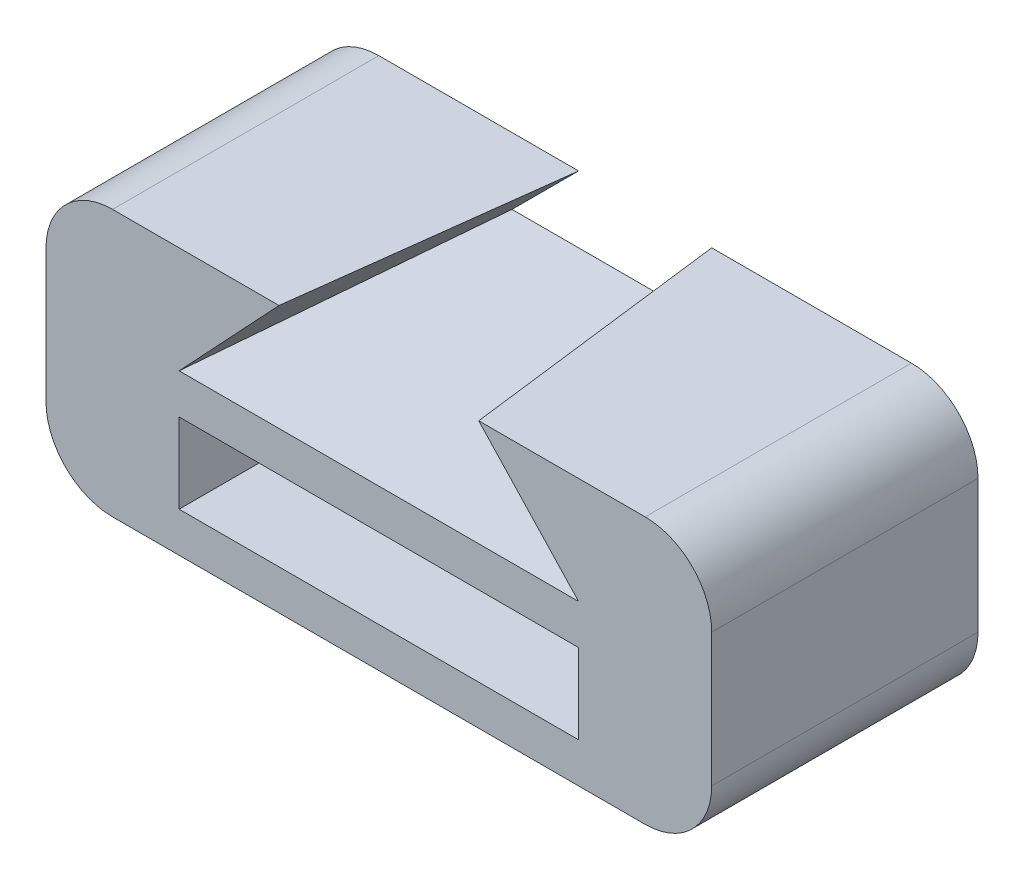
ISO-10303-21;
HEADER;
FILE_DESCRIPTION(('STEP AP214'),'2;1');
FILE_NAME('part.step','',(''),(''),'','','');
FILE_SCHEMA(('AUTOMOTIVE_DESIGN { 1 0 10303 214 1 1 1 1 }'));
ENDSEC;
DATA;
#1=APPLICATION_CONTEXT('core data for automotive mechanical design processes');
#2=APPLICATION_PROTOCOL_DEFINITION('international standard','automotive_design',2000,#1);
#3=PRODUCT_CONTEXT('',#1,'mechanical');
#4=PRODUCT('Part','Part','',(#3));
#5=PRODUCT_RELATED_PRODUCT_CATEGORY('part','',(#4));
#6=PRODUCT_DEFINITION_FORMATION('','',#4);
#7=PRODUCT_DEFINITION_CONTEXT('part definition',#1,'design');
#8=PRODUCT_DEFINITION('design','',#6,#7);
#9=PRODUCT_DEFINITION_SHAPE('','',#8);
#10=(LENGTH_UNIT() NAMED_UNIT(*) SI_UNIT(.MILLI.,.METRE.));
#11=(NAMED_UNIT(*) PLANE_ANGLE_UNIT() SI_UNIT($,.RADIAN.));
#12=(NAMED_UNIT(*) SI_UNIT($,.STERADIAN.) SOLID_ANGLE_UNIT());
#13=UNCERTAINTY_MEASURE_WITH_UNIT(LENGTH_MEASURE(1.E-05),#10,'distance_accuracy_value','');
#14=(GEOMETRIC_REPRESENTATION_CONTEXT(3) GLOBAL_UNCERTAINTY_ASSIGNED_CONTEXT((#13)) GLOBAL_UNIT_ASSIGNED_CONTEXT((#10,
#11,#12)) REPRESENTATION_CONTEXT('',''));
#15=CARTESIAN_POINT('',(0.,0.,0.));
#16=DIRECTION('',(0.,0.,1.));
#17=DIRECTION('',(1.,0.,0.));
#18=AXIS2_PLACEMENT_3D('',#15,#16,#17);
#19=CARTESIAN_POINT('',(-25.,12.5,20.));
#20=DIRECTION('',(0.,-1.,0.));
#21=DIRECTION('',(0.,0.,-1.));
#22=AXIS2_PLACEMENT_3D('',#19,#20,#21);
#23=PLANE('',#22);
#24=DIRECTION('',(-1.,0.,0.));
#25=VECTOR('',#24,1.);
#26=CARTESIAN_POINT('',(-25.,12.5,20.));
#27=LINE('',#26,#25);
#28=CARTESIAN_POINT('',(20.,12.5,20.));
#29=VERTEX_POINT('',#28);
#30=CARTESIAN_POINT('',(7.5,12.5,20.));
#31=VERTEX_POINT('',#30);
#32=EDGE_CURVE('E284',#29,#31,#27,.T.);
#33=ORIENTED_EDGE('',*,*,#32,.F.);
#34=DIRECTION('',(0.,0.,-1.));
#35=VECTOR('',#34,1.);
#36=CARTESIAN_POINT('',(20.,12.5,20.));
#37=LINE('',#36,#35);
#38=CARTESIAN_POINT('',(20.,12.5,0.));
#39=VERTEX_POINT('',#38);
#40=EDGE_CURVE('E335',#29,#39,#37,.T.);
#41=ORIENTED_EDGE('',*,*,#40,.T.);
#42=DIRECTION('',(-1.,0.,0.));
#43=VECTOR('',#42,1.);
#44=CARTESIAN_POINT('',(-25.,12.5,0.));
#45=LINE('',#44,#43);
#46=CARTESIAN_POINT('',(5.,12.5,0.));
#47=VERTEX_POINT('',#46);
#48=EDGE_CURVE('E280',#39,#47,#45,.T.);
#49=ORIENTED_EDGE('',*,*,#48,.T.);
#50=CARTESIAN_POINT('',(5.,12.5,0.));
#51=CARTESIAN_POINT('',(5.83333333333334,12.5,6.66666666666667));
#52=CARTESIAN_POINT('',(6.66666666666667,12.5,13.3333333333333));
#53=CARTESIAN_POINT('',(7.5,12.5,20.));
#54=B_SPLINE_CURVE_WITH_KNOTS('',3,(#50,#51,#52,#53),.UNSPECIFIED.,.F.,.F.,(4,4),(0.,1.),.UNSPECIFIED.);
#55=EDGE_CURVE('E277',#47,#31,#54,.T.);
#56=ORIENTED_EDGE('',*,*,#55,.T.);
#57=EDGE_LOOP('',(#33,#41,#49,#56));
#58=FACE_BOUND('',#57,.T.);
#59=ADVANCED_FACE('F111',(#58),#23,.F.);
#60=CARTESIAN_POINT('',(0.,0.,20.));
#61=DIRECTION('',(0.,0.,1.));
#62=DIRECTION('',(1.,0.,0.));
#63=AXIS2_PLACEMENT_3D('',#60,#61,#62);
#64=PLANE('',#63);
#65=DIRECTION('',(0.,1.,0.));
#66=VECTOR('',#65,1.);
#67=CARTESIAN_POINT('',(25.,12.5,20.));
#68=LINE('',#67,#66);
#69=CARTESIAN_POINT('',(25.,-2.5,20.));
#70=VERTEX_POINT('',#69);
#71=CARTESIAN_POINT('',(25.,7.5,20.));
#72=VERTEX_POINT('',#71);
#73=EDGE_CURVE('E294',#70,#72,#68,.T.);
#74=ORIENTED_EDGE('',*,*,#73,.T.);
#75=CARTESIAN_POINT('',(20.,7.5,20.));
#76=DIRECTION('',(0.,0.,1.));
#77=DIRECTION('',(1.,0.,0.));
#78=AXIS2_PLACEMENT_3D('',#75,#76,#77);
#79=CIRCLE('',#78,5.);
#80=EDGE_CURVE('E317',#72,#29,#79,.T.);
#81=ORIENTED_EDGE('',*,*,#80,.T.);
#82=ORIENTED_EDGE('',*,*,#32,.T.);
#83=DIRECTION('',(-0.68394112888133,0.729537204140085,0.));
#84=VECTOR('',#83,1.);
#85=CARTESIAN_POINT('',(7.5,12.5,20.));
#86=LINE('',#85,#84);
#87=CARTESIAN_POINT('',(15.,4.50000000000001,20.));
#88=VERTEX_POINT('',#87);
#89=EDGE_CURVE('E272',#88,#31,#86,.T.);
#90=ORIENTED_EDGE('',*,*,#89,.F.);
#91=DIRECTION('',(1.,0.,0.));
#92=VECTOR('',#91,1.);
#93=CARTESIAN_POINT('',(-15.,4.50000000000001,20.));
#94=LINE('',#93,#92);
#95=CARTESIAN_POINT('',(-15.,4.50000000000001,20.));
#96=VERTEX_POINT('',#95);
#97=EDGE_CURVE('E268',#96,#88,#94,.T.);
#98=ORIENTED_EDGE('',*,*,#97,.F.);
#99=DIRECTION('',(-0.68394112888133,-0.729537204140085,0.));
#100=VECTOR('',#99,1.);
#101=CARTESIAN_POINT('',(-7.5,12.5,20.));
#102=LINE('',#101,#100);
#103=CARTESIAN_POINT('',(-7.5,12.5,20.));
#104=VERTEX_POINT('',#103);
#105=EDGE_CURVE('E231',#104,#96,#102,.T.);
#106=ORIENTED_EDGE('',*,*,#105,.F.);
#107=CARTESIAN_POINT('',(-20.,12.5,20.));
#108=VERTEX_POINT('',#107);
#109=EDGE_CURVE('E256',#104,#108,#27,.T.);
#110=ORIENTED_EDGE('',*,*,#109,.T.);
#111=CARTESIAN_POINT('',(-20.,7.5,20.));
#112=DIRECTION('',(0.,0.,1.));
#113=DIRECTION('',(1.,0.,0.));
#114=AXIS2_PLACEMENT_3D('',#111,#112,#113);
#115=CIRCLE('',#114,5.);
#116=CARTESIAN_POINT('',(-25.,7.5,20.));
#117=VERTEX_POINT('',#116);
#118=EDGE_CURVE('E322',#108,#117,#115,.T.);
#119=ORIENTED_EDGE('',*,*,#118,.T.);
#120=DIRECTION('',(0.,-1.,0.));
#121=VECTOR('',#120,1.);
#122=CARTESIAN_POINT('',(-25.,12.5,20.));
#123=LINE('',#122,#121);
#124=CARTESIAN_POINT('',(-25.,-2.5,20.));
#125=VERTEX_POINT('',#124);
#126=EDGE_CURVE('E341',#117,#125,#123,.T.);
#127=ORIENTED_EDGE('',*,*,#126,.T.);
#128=CARTESIAN_POINT('',(-20.,-2.5,20.));
#129=DIRECTION('',(0.,0.,1.));
#130=DIRECTION('',(1.,0.,0.));
#131=AXIS2_PLACEMENT_3D('',#128,#129,#130);
#132=CIRCLE('',#131,5.);
#133=CARTESIAN_POINT('',(-20.,-7.5,20.));
#134=VERTEX_POINT('',#133);
#135=EDGE_CURVE('E133',#125,#134,#132,.T.);
#136=ORIENTED_EDGE('',*,*,#135,.T.);
#137=DIRECTION('',(1.,0.,0.));
#138=VECTOR('',#137,1.);
#139=CARTESIAN_POINT('',(-25.,-7.5,20.));
#140=LINE('',#139,#138);
#141=CARTESIAN_POINT('',(20.,-7.5,20.));
#142=VERTEX_POINT('',#141);
#143=EDGE_CURVE('E337',#134,#142,#140,.T.);
#144=ORIENTED_EDGE('',*,*,#143,.T.);
#145=CARTESIAN_POINT('',(20.,-2.5,20.));
#146=DIRECTION('',(0.,0.,1.));
#147=DIRECTION('',(1.,0.,0.));
#148=AXIS2_PLACEMENT_3D('',#145,#146,#147);
#149=CIRCLE('',#148,5.);
#150=EDGE_CURVE('E319',#142,#70,#149,.T.);
#151=ORIENTED_EDGE('',*,*,#150,.T.);
#152=EDGE_LOOP('',(#74,#81,#82,#90,#98,#106,#110,#119,#127,#136,#144,#151));
#153=FACE_BOUND('',#152,.T.);
#154=DIRECTION('',(-1.,0.,0.));
#155=VECTOR('',#154,1.);
#156=CARTESIAN_POINT('',(-15.,1.5,20.));
#157=LINE('',#156,#155);
#158=CARTESIAN_POINT('',(15.,1.5,20.));
#159=VERTEX_POINT('',#158);
#160=CARTESIAN_POINT('',(-15.,1.5,20.));
#161=VERTEX_POINT('',#160);
#162=EDGE_CURVE('E374',#159,#161,#157,.T.);
#163=ORIENTED_EDGE('',*,*,#162,.F.);
#164=DIRECTION('',(0.,1.,0.));
#165=VECTOR('',#164,1.);
#166=CARTESIAN_POINT('',(15.,1.5,20.));
#167=LINE('',#166,#165);
#168=CARTESIAN_POINT('',(15.,-4.5,20.));
#169=VERTEX_POINT('',#168);
#170=EDGE_CURVE('E361',#169,#159,#167,.T.);
#171=ORIENTED_EDGE('',*,*,#170,.F.);
#172=DIRECTION('',(1.,0.,0.));
#173=VECTOR('',#172,1.);
#174=CARTESIAN_POINT('',(-15.,-4.5,20.));
#175=LINE('',#174,#173);
#176=CARTESIAN_POINT('',(-15.,-4.5,20.));
#177=VERTEX_POINT('',#176);
#178=EDGE_CURVE('E357',#177,#169,#175,.T.);
#179=ORIENTED_EDGE('',*,*,#178,.F.);
#180=DIRECTION('',(0.,-1.,0.));
#181=VECTOR('',#180,1.);
#182=CARTESIAN_POINT('',(-15.,1.5,20.));
#183=LINE('',#182,#181);
#184=EDGE_CURVE('E371',#161,#177,#183,.T.);
#185=ORIENTED_EDGE('',*,*,#184,.F.);
#186=EDGE_LOOP('',(#163,#171,#179,#185));
#187=FACE_BOUND('',#186,.T.);
#188=ADVANCED_FACE('F411',(#153,#187),#64,.T.);
#189=CARTESIAN_POINT('',(0.,0.,0.));
#190=DIRECTION('',(0.,0.,1.));
#191=DIRECTION('',(1.,0.,0.));
#192=AXIS2_PLACEMENT_3D('',#189,#190,#191);
#193=PLANE('',#192);
#194=ORIENTED_EDGE('',*,*,#48,.F.);
#195=CARTESIAN_POINT('',(20.,7.5,0.));
#196=DIRECTION('',(0.,0.,1.));
#197=DIRECTION('',(1.,0.,0.));
#198=AXIS2_PLACEMENT_3D('',#195,#196,#197);
#199=CIRCLE('',#198,5.);
#200=CARTESIAN_POINT('',(25.,7.5,0.));
#201=VERTEX_POINT('',#200);
#202=EDGE_CURVE('E329',#39,#201,#199,.F.);
#203=ORIENTED_EDGE('',*,*,#202,.T.);
#204=DIRECTION('',(0.,1.,0.));
#205=VECTOR('',#204,1.);
#206=CARTESIAN_POINT('',(25.,12.5,0.));
#207=LINE('',#206,#205);
#208=CARTESIAN_POINT('',(25.,-2.5,0.));
#209=VERTEX_POINT('',#208);
#210=EDGE_CURVE('E289',#209,#201,#207,.T.);
#211=ORIENTED_EDGE('',*,*,#210,.F.);
#212=CARTESIAN_POINT('',(20.,-2.5,0.));
#213=DIRECTION('',(0.,0.,1.));
#214=DIRECTION('',(1.,0.,0.));
#215=AXIS2_PLACEMENT_3D('',#212,#213,#214);
#216=CIRCLE('',#215,5.);
#217=CARTESIAN_POINT('',(20.,-7.5,0.));
#218=VERTEX_POINT('',#217);
#219=EDGE_CURVE('E331',#209,#218,#216,.F.);
#220=ORIENTED_EDGE('',*,*,#219,.T.);
#221=DIRECTION('',(1.,0.,0.));
#222=VECTOR('',#221,1.);
#223=CARTESIAN_POINT('',(-25.,-7.5,0.));
#224=LINE('',#223,#222);
#225=CARTESIAN_POINT('',(-20.,-7.5,0.));
#226=VERTEX_POINT('',#225);
#227=EDGE_CURVE('E293',#226,#218,#224,.T.);
#228=ORIENTED_EDGE('',*,*,#227,.F.);
#229=CARTESIAN_POINT('',(-20.,-2.5,0.));
#230=DIRECTION('',(0.,0.,1.));
#231=DIRECTION('',(1.,0.,0.));
#232=AXIS2_PLACEMENT_3D('',#229,#230,#231);
#233=CIRCLE('',#232,5.);
#234=CARTESIAN_POINT('',(-25.,-2.5,0.));
#235=VERTEX_POINT('',#234);
#236=EDGE_CURVE('E311',#226,#235,#233,.F.);
#237=ORIENTED_EDGE('',*,*,#236,.T.);
#238=DIRECTION('',(0.,-1.,0.));
#239=VECTOR('',#238,1.);
#240=CARTESIAN_POINT('',(-25.,12.5,0.));
#241=LINE('',#240,#239);
#242=CARTESIAN_POINT('',(-25.,7.5,0.));
#243=VERTEX_POINT('',#242);
#244=EDGE_CURVE('E283',#243,#235,#241,.T.);
#245=ORIENTED_EDGE('',*,*,#244,.F.);
#246=CARTESIAN_POINT('',(-20.,7.5,0.));
#247=DIRECTION('',(0.,0.,1.));
#248=DIRECTION('',(1.,0.,0.));
#249=AXIS2_PLACEMENT_3D('',#246,#247,#248);
#250=CIRCLE('',#249,5.);
#251=CARTESIAN_POINT('',(-20.,12.5,0.));
#252=VERTEX_POINT('',#251);
#253=EDGE_CURVE('E334',#243,#252,#250,.F.);
#254=ORIENTED_EDGE('',*,*,#253,.T.);
#255=CARTESIAN_POINT('',(-5.,12.5,0.));
#256=VERTEX_POINT('',#255);
#257=EDGE_CURVE('E251',#256,#252,#45,.T.);
#258=ORIENTED_EDGE('',*,*,#257,.F.);
#259=DIRECTION('',(0.707106781186547,0.707106781186548,0.));
#260=VECTOR('',#259,1.);
#261=CARTESIAN_POINT('',(-10.,7.5,0.));
#262=LINE('',#261,#260);
#263=CARTESIAN_POINT('',(-10.,7.5,0.));
#264=VERTEX_POINT('',#263);
#265=EDGE_CURVE('E228',#264,#256,#262,.T.);
#266=ORIENTED_EDGE('',*,*,#265,.F.);
#267=DIRECTION('',(-1.,0.,0.));
#268=VECTOR('',#267,1.);
#269=CARTESIAN_POINT('',(10.,7.5,0.));
#270=LINE('',#269,#268);
#271=CARTESIAN_POINT('',(10.,7.5,0.));
#272=VERTEX_POINT('',#271);
#273=EDGE_CURVE('E238',#272,#264,#270,.T.);
#274=ORIENTED_EDGE('',*,*,#273,.F.);
#275=DIRECTION('',(0.707106781186547,-0.707106781186548,0.));
#276=VECTOR('',#275,1.);
#277=CARTESIAN_POINT('',(5.,12.5,0.));
#278=LINE('',#277,#276);
#279=EDGE_CURVE('E244',#47,#272,#278,.T.);
#280=ORIENTED_EDGE('',*,*,#279,.F.);
#281=EDGE_LOOP('',(#194,#203,#211,#220,#228,#237,#245,#254,#258,#266,#274,#280));
#282=FACE_BOUND('',#281,.T.);
#283=DIRECTION('',(0.,1.,0.));
#284=VECTOR('',#283,1.);
#285=CARTESIAN_POINT('',(15.,1.5,0.));
#286=LINE('',#285,#284);
#287=CARTESIAN_POINT('',(15.,-4.5,0.));
#288=VERTEX_POINT('',#287);
#289=CARTESIAN_POINT('',(15.,1.5,0.));
#290=VERTEX_POINT('',#289);
#291=EDGE_CURVE('E267',#288,#290,#286,.T.);
#292=ORIENTED_EDGE('',*,*,#291,.T.);
#293=DIRECTION('',(-1.,0.,0.));
#294=VECTOR('',#293,1.);
#295=CARTESIAN_POINT('',(-15.,1.5,0.));
#296=LINE('',#295,#294);
#297=CARTESIAN_POINT('',(-15.,1.5,0.));
#298=VERTEX_POINT('',#297);
#299=EDGE_CURVE('E365',#290,#298,#296,.T.);
#300=ORIENTED_EDGE('',*,*,#299,.T.);
#301=DIRECTION('',(0.,-1.,0.));
#302=VECTOR('',#301,1.);
#303=CARTESIAN_POINT('',(-15.,1.5,0.));
#304=LINE('',#303,#302);
#305=CARTESIAN_POINT('',(-15.,-4.5,0.));
#306=VERTEX_POINT('',#305);
#307=EDGE_CURVE('E362',#298,#306,#304,.T.);
#308=ORIENTED_EDGE('',*,*,#307,.T.);
#309=DIRECTION('',(1.,0.,0.));
#310=VECTOR('',#309,1.);
#311=CARTESIAN_POINT('',(-15.,-4.5,0.));
#312=LINE('',#311,#310);
#313=EDGE_CURVE('E358',#306,#288,#312,.T.);
#314=ORIENTED_EDGE('',*,*,#313,.T.);
#315=EDGE_LOOP('',(#292,#300,#308,#314));
#316=FACE_BOUND('',#315,.T.);
#317=ADVANCED_FACE('F248',(#282,#316),#193,.F.);
#318=CARTESIAN_POINT('',(25.,12.5,20.));
#319=DIRECTION('',(-1.,0.,0.));
#320=DIRECTION('',(0.,0.,1.));
#321=AXIS2_PLACEMENT_3D('',#318,#319,#320);
#322=PLANE('',#321);
#323=ORIENTED_EDGE('',*,*,#210,.T.);
#324=DIRECTION('',(0.,0.,-1.));
#325=VECTOR('',#324,1.);
#326=CARTESIAN_POINT('',(25.,7.5,20.));
#327=LINE('',#326,#325);
#328=EDGE_CURVE('E324',#201,#72,#327,.F.);
#329=ORIENTED_EDGE('',*,*,#328,.T.);
#330=ORIENTED_EDGE('',*,*,#73,.F.);
#331=DIRECTION('',(0.,0.,-1.));
#332=VECTOR('',#331,1.);
#333=CARTESIAN_POINT('',(25.,-2.5,20.));
#334=LINE('',#333,#332);
#335=EDGE_CURVE('E326',#70,#209,#334,.T.);
#336=ORIENTED_EDGE('',*,*,#335,.T.);
#337=EDGE_LOOP('',(#323,#329,#330,#336));
#338=FACE_BOUND('',#337,.T.);
#339=ADVANCED_FACE('F422',(#338),#322,.F.);
#340=ORIENTED_EDGE('',*,*,#257,.T.);
#341=DIRECTION('',(0.,0.,-1.));
#342=VECTOR('',#341,1.);
#343=CARTESIAN_POINT('',(-20.,12.5,20.));
#344=LINE('',#343,#342);
#345=EDGE_CURVE('E13',#252,#108,#344,.F.);
#346=ORIENTED_EDGE('',*,*,#345,.T.);
#347=ORIENTED_EDGE('',*,*,#109,.F.);
#348=CARTESIAN_POINT('',(-5.,12.5,0.));
#349=CARTESIAN_POINT('',(-5.83333333333333,12.5,6.66666666666667));
#350=CARTESIAN_POINT('',(-6.66666666666666,12.5,13.3333333333333));
#351=CARTESIAN_POINT('',(-7.5,12.5,20.));
#352=B_SPLINE_CURVE_WITH_KNOTS('',3,(#348,#349,#350,#351),.UNSPECIFIED.,.F.,.F.,(4,4),(0.,1.),.UNSPECIFIED.);
#353=EDGE_CURVE('E235',#256,#104,#352,.T.);
#354=ORIENTED_EDGE('',*,*,#353,.F.);
#355=EDGE_LOOP('',(#340,#346,#347,#354));
#356=FACE_BOUND('',#355,.T.);
#357=ADVANCED_FACE('F420',(#356),#23,.F.);
#358=CARTESIAN_POINT('',(-25.,12.5,20.));
#359=DIRECTION('',(1.,0.,0.));
#360=DIRECTION('',(0.,1.,0.));
#361=AXIS2_PLACEMENT_3D('',#358,#359,#360);
#362=PLANE('',#361);
#363=ORIENTED_EDGE('',*,*,#244,.T.);
#364=DIRECTION('',(0.,0.,-1.));
#365=VECTOR('',#364,1.);
#366=CARTESIAN_POINT('',(-25.,-2.5,20.));
#367=LINE('',#366,#365);
#368=EDGE_CURVE('E119',#235,#125,#367,.F.);
#369=ORIENTED_EDGE('',*,*,#368,.T.);
#370=ORIENTED_EDGE('',*,*,#126,.F.);
#371=DIRECTION('',(0.,0.,-1.));
#372=VECTOR('',#371,1.);
#373=CARTESIAN_POINT('',(-25.,7.5,20.));
#374=LINE('',#373,#372);
#375=EDGE_CURVE('E307',#117,#243,#374,.T.);
#376=ORIENTED_EDGE('',*,*,#375,.T.);
#377=EDGE_LOOP('',(#363,#369,#370,#376));
#378=FACE_BOUND('',#377,.T.);
#379=ADVANCED_FACE('F304',(#378),#362,.F.);
#380=CARTESIAN_POINT('',(-25.,-7.5,20.));
#381=DIRECTION('',(0.,1.,0.));
#382=DIRECTION('',(0.,0.,1.));
#383=AXIS2_PLACEMENT_3D('',#380,#381,#382);
#384=PLANE('',#383);
#385=ORIENTED_EDGE('',*,*,#227,.T.);
#386=DIRECTION('',(0.,0.,-1.));
#387=VECTOR('',#386,1.);
#388=CARTESIAN_POINT('',(20.,-7.5,20.));
#389=LINE('',#388,#387);
#390=EDGE_CURVE('E126',#218,#142,#389,.F.);
#391=ORIENTED_EDGE('',*,*,#390,.T.);
#392=ORIENTED_EDGE('',*,*,#143,.F.);
#393=DIRECTION('',(0.,0.,-1.));
#394=VECTOR('',#393,1.);
#395=CARTESIAN_POINT('',(-20.,-7.5,20.));
#396=LINE('',#395,#394);
#397=EDGE_CURVE('E315',#134,#226,#396,.T.);
#398=ORIENTED_EDGE('',*,*,#397,.T.);
#399=EDGE_LOOP('',(#385,#391,#392,#398));
#400=FACE_BOUND('',#399,.T.);
#401=ADVANCED_FACE('F428',(#400),#384,.F.);
#402=CARTESIAN_POINT('',(15.,1.5,20.));
#403=DIRECTION('',(-1.,0.,0.));
#404=DIRECTION('',(0.,-1.,0.));
#405=AXIS2_PLACEMENT_3D('',#402,#403,#404);
#406=PLANE('',#405);
#407=ORIENTED_EDGE('',*,*,#291,.F.);
#408=DIRECTION('',(0.,0.,-1.));
#409=VECTOR('',#408,1.);
#410=CARTESIAN_POINT('',(15.,-4.5,20.));
#411=LINE('',#410,#409);
#412=EDGE_CURVE('E354',#169,#288,#411,.T.);
#413=ORIENTED_EDGE('',*,*,#412,.F.);
#414=ORIENTED_EDGE('',*,*,#170,.T.);
#415=DIRECTION('',(0.,0.,-1.));
#416=VECTOR('',#415,1.);
#417=CARTESIAN_POINT('',(15.,1.5,20.));
#418=LINE('',#417,#416);
#419=EDGE_CURVE('E347',#159,#290,#418,.T.);
#420=ORIENTED_EDGE('',*,*,#419,.T.);
#421=EDGE_LOOP('',(#407,#413,#414,#420));
#422=FACE_BOUND('',#421,.T.);
#423=ADVANCED_FACE('F442',(#422),#406,.T.);
#424=CARTESIAN_POINT('',(-15.,1.5,20.));
#425=DIRECTION('',(0.,-1.,0.));
#426=DIRECTION('',(0.,0.,-1.));
#427=AXIS2_PLACEMENT_3D('',#424,#425,#426);
#428=PLANE('',#427);
#429=ORIENTED_EDGE('',*,*,#299,.F.);
#430=ORIENTED_EDGE('',*,*,#419,.F.);
#431=ORIENTED_EDGE('',*,*,#162,.T.);
#432=DIRECTION('',(0.,0.,-1.));
#433=VECTOR('',#432,1.);
#434=CARTESIAN_POINT('',(-15.,1.5,20.));
#435=LINE('',#434,#433);
#436=EDGE_CURVE('E350',#161,#298,#435,.T.);
#437=ORIENTED_EDGE('',*,*,#436,.T.);
#438=EDGE_LOOP('',(#429,#430,#431,#437));
#439=FACE_BOUND('',#438,.T.);
#440=ADVANCED_FACE('F449',(#439),#428,.T.);
#441=CARTESIAN_POINT('',(-15.,1.5,20.));
#442=DIRECTION('',(1.,0.,0.));
#443=DIRECTION('',(0.,1.,0.));
#444=AXIS2_PLACEMENT_3D('',#441,#442,#443);
#445=PLANE('',#444);
#446=ORIENTED_EDGE('',*,*,#307,.F.);
#447=ORIENTED_EDGE('',*,*,#436,.F.);
#448=ORIENTED_EDGE('',*,*,#184,.T.);
#449=DIRECTION('',(0.,0.,-1.));
#450=VECTOR('',#449,1.);
#451=CARTESIAN_POINT('',(-15.,-4.5,20.));
#452=LINE('',#451,#450);
#453=EDGE_CURVE('E352',#177,#306,#452,.T.);
#454=ORIENTED_EDGE('',*,*,#453,.T.);
#455=EDGE_LOOP('',(#446,#447,#448,#454));
#456=FACE_BOUND('',#455,.T.);
#457=ADVANCED_FACE('F454',(#456),#445,.T.);
#458=CARTESIAN_POINT('',(-15.,-4.5,20.));
#459=DIRECTION('',(0.,1.,0.));
#460=DIRECTION('',(0.,0.,1.));
#461=AXIS2_PLACEMENT_3D('',#458,#459,#460);
#462=PLANE('',#461);
#463=ORIENTED_EDGE('',*,*,#313,.F.);
#464=ORIENTED_EDGE('',*,*,#453,.F.);
#465=ORIENTED_EDGE('',*,*,#178,.T.);
#466=ORIENTED_EDGE('',*,*,#412,.T.);
#467=EDGE_LOOP('',(#463,#464,#465,#466));
#468=FACE_BOUND('',#467,.T.);
#469=ADVANCED_FACE('F461',(#468),#462,.T.);
#470=CARTESIAN_POINT('',(10.,7.5,0.));
#471=CARTESIAN_POINT('',(11.6666666666667,6.5,6.66666666666667));
#472=CARTESIAN_POINT('',(13.3333333333333,5.50000000000001,13.3333333333333));
#473=CARTESIAN_POINT('',(15.,4.50000000000001,20.));
#474=CARTESIAN_POINT('',(9.58333333333334,7.91666666666667,0.));
#475=CARTESIAN_POINT('',(11.1805555555556,7.,6.66666666666667));
#476=CARTESIAN_POINT('',(12.7777777777778,6.08333333333334,13.3333333333333));
#477=CARTESIAN_POINT('',(14.375,5.16666666666667,20.));
#478=CARTESIAN_POINT('',(8.75000000000002,8.75000000000001,0.));
#479=CARTESIAN_POINT('',(10.2083333333333,8.00000000000001,6.66666666666667));
#480=CARTESIAN_POINT('',(11.6666666666667,7.25000000000001,13.3333333333333));
#481=CARTESIAN_POINT('',(13.125,6.50000000000002,20.));
#482=CARTESIAN_POINT('',(7.49999999999999,9.99999999999999,0.));
#483=CARTESIAN_POINT('',(8.74999999999999,9.5,6.66666666666667));
#484=CARTESIAN_POINT('',(9.99999999999999,9.,13.3333333333333));
#485=CARTESIAN_POINT('',(11.25,8.5,20.));
#486=CARTESIAN_POINT('',(6.25000000000001,11.25,0.));
#487=CARTESIAN_POINT('',(7.29166666666667,11.,6.66666666666667));
#488=CARTESIAN_POINT('',(8.33333333333334,10.75,13.3333333333333));
#489=CARTESIAN_POINT('',(9.37500000000001,10.5,20.));
#490=CARTESIAN_POINT('',(5.41666666666667,12.0833333333333,0.));
#491=CARTESIAN_POINT('',(6.31944444444445,12.,6.66666666666667));
#492=CARTESIAN_POINT('',(7.22222222222222,11.9166666666667,13.3333333333333));
#493=CARTESIAN_POINT('',(8.125,11.8333333333333,20.));
#494=CARTESIAN_POINT('',(5.,12.5,0.));
#495=CARTESIAN_POINT('',(5.83333333333334,12.5,6.66666666666667));
#496=CARTESIAN_POINT('',(6.66666666666667,12.5,13.3333333333333));
#497=CARTESIAN_POINT('',(7.5,12.5,20.));
#498=B_SPLINE_SURFACE_WITH_KNOTS('',3,3,((#470,#471,#472,#473),(#474,#475,#476,#477),(#478,#479,
#480,#481),(#482,#483,#484,#485),(#486,#487,#488,#489),(#490,#491,#492,#493),(#494,#495,#496,
#497)),.UNSPECIFIED.,.F.,.F.,.F.,(4,1,1,1,4),(4,4),(0.837987449950442,0.878490587462831,
0.918993724975221,0.959496862487611,1.),(0.,1.),.UNSPECIFIED.);
#499=CARTESIAN_POINT('',(10.,7.5,0.));
#500=CARTESIAN_POINT('',(11.6666666666667,6.5,6.66666666666667));
#501=CARTESIAN_POINT('',(13.3333333333333,5.50000000000001,13.3333333333333));
#502=CARTESIAN_POINT('',(15.,4.50000000000001,20.));
#503=B_SPLINE_CURVE_WITH_KNOTS('',3,(#499,#500,#501,#502),.UNSPECIFIED.,.F.,.F.,(4,4),(0.,1.),.UNSPECIFIED.);
#504=EDGE_CURVE('E234',#272,#88,#503,.T.);
#505=ORIENTED_EDGE('',*,*,#279,.T.);
#506=ORIENTED_EDGE('',*,*,#504,.T.);
#507=ORIENTED_EDGE('',*,*,#89,.T.);
#508=ORIENTED_EDGE('',*,*,#55,.F.);
#509=EDGE_LOOP('',(#505,#506,#507,#508));
#510=FACE_BOUND('',#509,.T.);
#511=ADVANCED_FACE('F409',(#510),#498,.F.);
#512=CARTESIAN_POINT('',(-9.99999999999999,7.5,0.));
#513=DIRECTION('',(0.,-0.988936352868298,-0.148340452930244));
#514=DIRECTION('',(1.,0.,0.));
#515=AXIS2_PLACEMENT_3D('',#512,#513,#514);
#516=PLANE('',#515);
#517=ORIENTED_EDGE('',*,*,#273,.T.);
#518=CARTESIAN_POINT('',(-9.99999999999999,7.5,0.));
#519=CARTESIAN_POINT('',(-11.6666666666667,6.5,6.66666666666667));
#520=CARTESIAN_POINT('',(-13.3333333333333,5.5,13.3333333333333));
#521=CARTESIAN_POINT('',(-15.,4.5,20.));
#522=B_SPLINE_CURVE_WITH_KNOTS('',3,(#518,#519,#520,#521),.UNSPECIFIED.,.F.,.F.,(4,4),(0.,1.),.UNSPECIFIED.);
#523=EDGE_CURVE('E224',#264,#96,#522,.T.);
#524=ORIENTED_EDGE('',*,*,#523,.T.);
#525=ORIENTED_EDGE('',*,*,#97,.T.);
#526=ORIENTED_EDGE('',*,*,#504,.F.);
#527=EDGE_LOOP('',(#517,#524,#525,#526));
#528=FACE_BOUND('',#527,.T.);
#529=ADVANCED_FACE('F239',(#528),#516,.F.);
#530=CARTESIAN_POINT('',(-5.,12.5,0.));
#531=CARTESIAN_POINT('',(-5.83333333333333,12.5,6.66666666666667));
#532=CARTESIAN_POINT('',(-6.66666666666666,12.5,13.3333333333333));
#533=CARTESIAN_POINT('',(-7.5,12.5,20.));
#534=CARTESIAN_POINT('',(-5.41666666666666,12.0833333333333,0.));
#535=CARTESIAN_POINT('',(-6.31944444444444,12.,6.66666666666667));
#536=CARTESIAN_POINT('',(-7.22222222222222,11.9166666666667,13.3333333333333));
#537=CARTESIAN_POINT('',(-8.125,11.8333333333333,20.));
#538=CARTESIAN_POINT('',(-6.24999999999999,11.25,0.));
#539=CARTESIAN_POINT('',(-7.29166666666666,11.,6.66666666666666));
#540=CARTESIAN_POINT('',(-8.33333333333333,10.75,13.3333333333333));
#541=CARTESIAN_POINT('',(-9.37499999999999,10.5,20.));
#542=CARTESIAN_POINT('',(-7.50000000000001,10.,0.));
#543=CARTESIAN_POINT('',(-8.75000000000001,9.50000000000001,6.66666666666668));
#544=CARTESIAN_POINT('',(-10.,9.00000000000002,13.3333333333334));
#545=CARTESIAN_POINT('',(-11.25,8.50000000000003,20.));
#546=CARTESIAN_POINT('',(-8.74999999999999,8.75,0.));
#547=CARTESIAN_POINT('',(-10.2083333333333,8.,6.66666666666666));
#548=CARTESIAN_POINT('',(-11.6666666666667,7.24999999999999,13.3333333333333));
#549=CARTESIAN_POINT('',(-13.125,6.49999999999999,20.));
#550=CARTESIAN_POINT('',(-9.58333333333333,7.91666666666667,0.));
#551=CARTESIAN_POINT('',(-11.1805555555556,7.,6.66666666666667));
#552=CARTESIAN_POINT('',(-12.7777777777778,6.08333333333334,13.3333333333333));
#553=CARTESIAN_POINT('',(-14.375,5.16666666666668,20.));
#554=CARTESIAN_POINT('',(-9.99999999999999,7.5,0.));
#555=CARTESIAN_POINT('',(-11.6666666666667,6.5,6.66666666666667));
#556=CARTESIAN_POINT('',(-13.3333333333333,5.5,13.3333333333333));
#557=CARTESIAN_POINT('',(-15.,4.5,20.));
#558=B_SPLINE_SURFACE_WITH_KNOTS('',3,3,((#530,#531,#532,#533),(#534,#535,#536,#537),(#538,#539,
#540,#541),(#542,#543,#544,#545),(#546,#547,#548,#549),(#550,#551,#552,#553),(#554,#555,#556,
#557)),.UNSPECIFIED.,.F.,.F.,.F.,(4,1,1,1,4),(4,4),(0.225324966633628,0.265828104146018,
0.306331241658407,0.346834379170796,0.387337516683186),(0.,1.),.UNSPECIFIED.);
#559=ORIENTED_EDGE('',*,*,#265,.T.);
#560=ORIENTED_EDGE('',*,*,#353,.T.);
#561=ORIENTED_EDGE('',*,*,#105,.T.);
#562=ORIENTED_EDGE('',*,*,#523,.F.);
#563=EDGE_LOOP('',(#559,#560,#561,#562));
#564=FACE_BOUND('',#563,.T.);
#565=ADVANCED_FACE('F226',(#564),#558,.F.);
#566=CARTESIAN_POINT('',(20.,7.5,20.));
#567=DIRECTION('',(0.,0.,-1.));
#568=DIRECTION('',(-1.,0.,0.));
#569=AXIS2_PLACEMENT_3D('',#566,#567,#568);
#570=CYLINDRICAL_SURFACE('',#569,5.);
#571=ORIENTED_EDGE('',*,*,#80,.F.);
#572=ORIENTED_EDGE('',*,*,#328,.F.);
#573=ORIENTED_EDGE('',*,*,#202,.F.);
#574=ORIENTED_EDGE('',*,*,#40,.F.);
#575=EDGE_LOOP('',(#571,#572,#573,#574));
#576=FACE_BOUND('',#575,.T.);
#577=ADVANCED_FACE('F489',(#576),#570,.T.);
#578=CARTESIAN_POINT('',(20.,-2.5,20.));
#579=DIRECTION('',(0.,0.,-1.));
#580=DIRECTION('',(-1.,0.,0.));
#581=AXIS2_PLACEMENT_3D('',#578,#579,#580);
#582=CYLINDRICAL_SURFACE('',#581,5.);
#583=ORIENTED_EDGE('',*,*,#150,.F.);
#584=ORIENTED_EDGE('',*,*,#390,.F.);
#585=ORIENTED_EDGE('',*,*,#219,.F.);
#586=ORIENTED_EDGE('',*,*,#335,.F.);
#587=EDGE_LOOP('',(#583,#584,#585,#586));
#588=FACE_BOUND('',#587,.T.);
#589=ADVANCED_FACE('F498',(#588),#582,.T.);
#590=CARTESIAN_POINT('',(-20.,-2.5,20.));
#591=DIRECTION('',(0.,0.,-1.));
#592=DIRECTION('',(-1.,0.,0.));
#593=AXIS2_PLACEMENT_3D('',#590,#591,#592);
#594=CYLINDRICAL_SURFACE('',#593,5.);
#595=ORIENTED_EDGE('',*,*,#135,.F.);
#596=ORIENTED_EDGE('',*,*,#368,.F.);
#597=ORIENTED_EDGE('',*,*,#236,.F.);
#598=ORIENTED_EDGE('',*,*,#397,.F.);
#599=EDGE_LOOP('',(#595,#596,#597,#598));
#600=FACE_BOUND('',#599,.T.);
#601=ADVANCED_FACE('F309',(#600),#594,.T.);
#602=CARTESIAN_POINT('',(-20.,7.5,20.));
#603=DIRECTION('',(0.,0.,-1.));
#604=DIRECTION('',(-1.,0.,0.));
#605=AXIS2_PLACEMENT_3D('',#602,#603,#604);
#606=CYLINDRICAL_SURFACE('',#605,5.);
#607=ORIENTED_EDGE('',*,*,#118,.F.);
#608=ORIENTED_EDGE('',*,*,#345,.F.);
#609=ORIENTED_EDGE('',*,*,#253,.F.);
#610=ORIENTED_EDGE('',*,*,#375,.F.);
#611=EDGE_LOOP('',(#607,#608,#609,#610));
#612=FACE_BOUND('',#611,.T.);
#613=ADVANCED_FACE('F113',(#612),#606,.T.);
#614=CLOSED_SHELL('',(#59,#188,#317,#339,#357,#379,#401,#423,#440,#457,#469,#511,#529,#565,#577,
#589,#601,#613));
#615=MANIFOLD_SOLID_BREP('B2',#614);
#616=ADVANCED_BREP_SHAPE_REPRESENTATION('',(#18,#615),#14);
#617=SHAPE_DEFINITION_REPRESENTATION(#9,#616);
ENDSEC;
END-ISO-10303-21;
